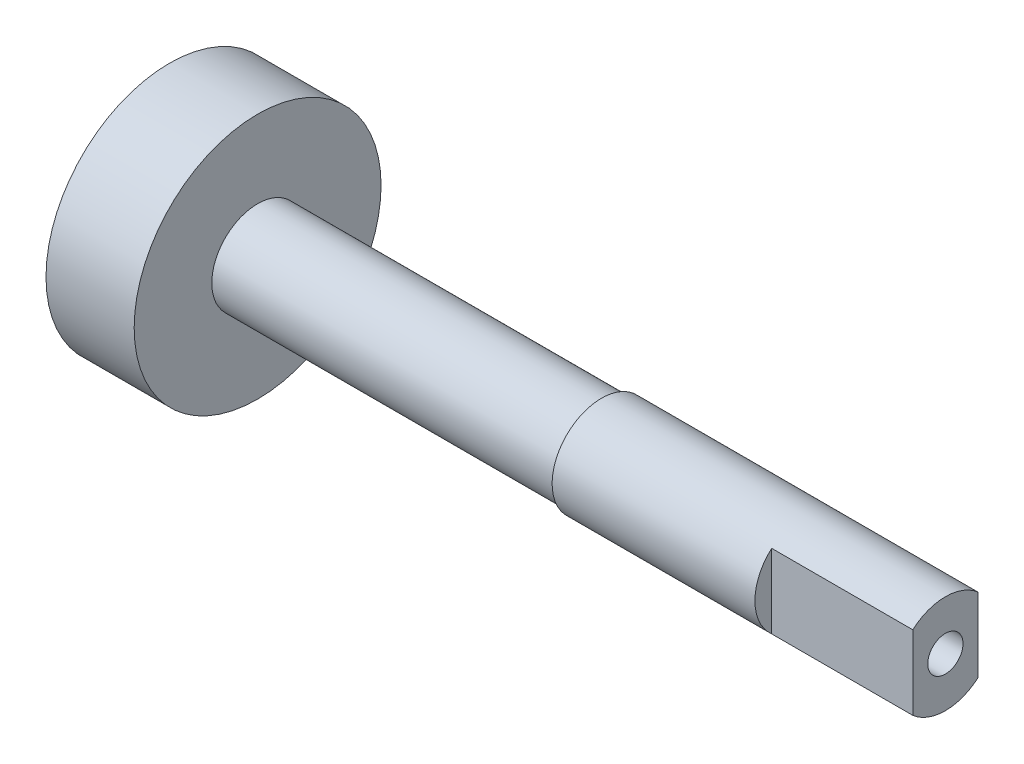
ISO-10303-21;
HEADER;
FILE_DESCRIPTION(('STEP AP214'),'2;1');
FILE_NAME('part.step','',(''),(''),'','','');
FILE_SCHEMA(('AUTOMOTIVE_DESIGN { 1 0 10303 214 1 1 1 1 }'));
ENDSEC;
DATA;
#1=APPLICATION_CONTEXT('core data for automotive mechanical design processes');
#2=APPLICATION_PROTOCOL_DEFINITION('international standard','automotive_design',2000,#1);
#3=PRODUCT_CONTEXT('',#1,'mechanical');
#4=PRODUCT('Part','Part','',(#3));
#5=PRODUCT_RELATED_PRODUCT_CATEGORY('part','',(#4));
#6=PRODUCT_DEFINITION_FORMATION('','',#4);
#7=PRODUCT_DEFINITION_CONTEXT('part definition',#1,'design');
#8=PRODUCT_DEFINITION('design','',#6,#7);
#9=PRODUCT_DEFINITION_SHAPE('','',#8);
#10=(LENGTH_UNIT() NAMED_UNIT(*) SI_UNIT(.MILLI.,.METRE.));
#11=(NAMED_UNIT(*) PLANE_ANGLE_UNIT() SI_UNIT($,.RADIAN.));
#12=(NAMED_UNIT(*) SI_UNIT($,.STERADIAN.) SOLID_ANGLE_UNIT());
#13=UNCERTAINTY_MEASURE_WITH_UNIT(LENGTH_MEASURE(1.E-05),#10,'distance_accuracy_value','');
#14=(GEOMETRIC_REPRESENTATION_CONTEXT(3) GLOBAL_UNCERTAINTY_ASSIGNED_CONTEXT((#13)) GLOBAL_UNIT_ASSIGNED_CONTEXT((#10,
#11,#12)) REPRESENTATION_CONTEXT('',''));
#15=CARTESIAN_POINT('',(0.,0.,0.));
#16=DIRECTION('',(0.,0.,1.));
#17=DIRECTION('',(1.,0.,0.));
#18=AXIS2_PLACEMENT_3D('',#15,#16,#17);
#19=CARTESIAN_POINT('',(-24.5,0.,0.));
#20=DIRECTION('',(1.,0.,0.));
#21=DIRECTION('',(0.,0.,-1.));
#22=AXIS2_PLACEMENT_3D('',#19,#20,#21);
#23=CYLINDRICAL_SURFACE('',#22,7.);
#24=CARTESIAN_POINT('',(-24.5,0.,0.));
#25=DIRECTION('',(-1.,0.,0.));
#26=DIRECTION('',(0.,0.,1.));
#27=AXIS2_PLACEMENT_3D('',#24,#25,#26);
#28=CIRCLE('',#27,7.);
#29=CARTESIAN_POINT('',(-24.5,0.,7.));
#30=VERTEX_POINT('',#29);
#31=EDGE_CURVE('E136',#30,#30,#28,.T.);
#32=ORIENTED_EDGE('',*,*,#31,.F.);
#33=EDGE_LOOP('',(#32));
#34=FACE_BOUND('',#33,.T.);
#35=CARTESIAN_POINT('',(-19.5,0.,0.));
#36=DIRECTION('',(-1.,0.,0.));
#37=DIRECTION('',(0.,0.,1.));
#38=AXIS2_PLACEMENT_3D('',#35,#36,#37);
#39=CIRCLE('',#38,7.);
#40=CARTESIAN_POINT('',(-19.5,0.,7.));
#41=VERTEX_POINT('',#40);
#42=EDGE_CURVE('E140',#41,#41,#39,.T.);
#43=ORIENTED_EDGE('',*,*,#42,.T.);
#44=EDGE_LOOP('',(#43));
#45=FACE_BOUND('',#44,.T.);
#46=ADVANCED_FACE('F47',(#34,#45),#23,.T.);
#47=CARTESIAN_POINT('',(-24.5,0.,0.));
#48=DIRECTION('',(-1.,0.,0.));
#49=DIRECTION('',(0.,0.,1.));
#50=AXIS2_PLACEMENT_3D('',#47,#48,#49);
#51=PLANE('',#50);
#52=ORIENTED_EDGE('',*,*,#31,.T.);
#53=EDGE_LOOP('',(#52));
#54=FACE_BOUND('',#53,.T.);
#55=ADVANCED_FACE('F177',(#54),#51,.T.);
#56=CARTESIAN_POINT('',(-19.5,0.,0.));
#57=DIRECTION('',(-1.,0.,0.));
#58=DIRECTION('',(0.,0.,1.));
#59=AXIS2_PLACEMENT_3D('',#56,#57,#58);
#60=PLANE('',#59);
#61=ORIENTED_EDGE('',*,*,#42,.F.);
#62=EDGE_LOOP('',(#61));
#63=FACE_BOUND('',#62,.T.);
#64=CARTESIAN_POINT('',(-19.5,0.,0.));
#65=DIRECTION('',(1.,0.,0.));
#66=DIRECTION('',(0.,0.,-1.));
#67=AXIS2_PLACEMENT_3D('',#64,#65,#66);
#68=CIRCLE('',#67,2.6);
#69=CARTESIAN_POINT('',(-19.5,0.,-2.6));
#70=VERTEX_POINT('',#69);
#71=EDGE_CURVE('E147',#70,#70,#68,.T.);
#72=ORIENTED_EDGE('',*,*,#71,.F.);
#73=EDGE_LOOP('',(#72));
#74=FACE_BOUND('',#73,.T.);
#75=ADVANCED_FACE('F184',(#63,#74),#60,.F.);
#76=CARTESIAN_POINT('',(0.,0.,0.));
#77=DIRECTION('',(1.,0.,0.));
#78=DIRECTION('',(0.,0.,-1.));
#79=AXIS2_PLACEMENT_3D('',#76,#77,#78);
#80=PLANE('',#79);
#81=CARTESIAN_POINT('',(0.,0.,0.));
#82=DIRECTION('',(1.,0.,0.));
#83=DIRECTION('',(0.,0.,-1.));
#84=AXIS2_PLACEMENT_3D('',#81,#82,#83);
#85=CIRCLE('',#84,2.6);
#86=CARTESIAN_POINT('',(0.,0.,-2.6));
#87=VERTEX_POINT('',#86);
#88=EDGE_CURVE('E150',#87,#87,#85,.T.);
#89=ORIENTED_EDGE('',*,*,#88,.T.);
#90=EDGE_LOOP('',(#89));
#91=FACE_BOUND('',#90,.T.);
#92=CARTESIAN_POINT('',(0.,0.,0.));
#93=DIRECTION('',(1.,0.,0.));
#94=DIRECTION('',(0.,0.,-1.));
#95=AXIS2_PLACEMENT_3D('',#92,#93,#94);
#96=CIRCLE('',#95,2.8);
#97=CARTESIAN_POINT('',(0.,0.,-2.8));
#98=VERTEX_POINT('',#97);
#99=EDGE_CURVE('E51',#98,#98,#96,.T.);
#100=ORIENTED_EDGE('',*,*,#99,.F.);
#101=EDGE_LOOP('',(#100));
#102=FACE_BOUND('',#101,.T.);
#103=ADVANCED_FACE('F210',(#91,#102),#80,.F.);
#104=CARTESIAN_POINT('',(-19.5,0.,0.));
#105=DIRECTION('',(1.,0.,0.));
#106=DIRECTION('',(0.,0.,-1.));
#107=AXIS2_PLACEMENT_3D('',#104,#105,#106);
#108=CYLINDRICAL_SURFACE('',#107,2.6);
#109=ORIENTED_EDGE('',*,*,#71,.T.);
#110=EDGE_LOOP('',(#109));
#111=FACE_BOUND('',#110,.T.);
#112=ORIENTED_EDGE('',*,*,#88,.F.);
#113=EDGE_LOOP('',(#112));
#114=FACE_BOUND('',#113,.T.);
#115=ADVANCED_FACE('F191',(#111,#114),#108,.T.);
#116=CARTESIAN_POINT('',(13.5,0.,0.));
#117=DIRECTION('',(1.,0.,0.));
#118=DIRECTION('',(0.,0.,-1.));
#119=AXIS2_PLACEMENT_3D('',#116,#117,#118);
#120=PLANE('',#119);
#121=CARTESIAN_POINT('',(13.5,0.,0.));
#122=DIRECTION('',(1.,0.,0.));
#123=DIRECTION('',(0.,0.,-1.));
#124=AXIS2_PLACEMENT_3D('',#121,#122,#123);
#125=CIRCLE('',#124,1.);
#126=CARTESIAN_POINT('',(13.5,0.,-1.));
#127=VERTEX_POINT('',#126);
#128=EDGE_CURVE('E123',#127,#127,#125,.T.);
#129=ORIENTED_EDGE('',*,*,#128,.T.);
#130=EDGE_LOOP('',(#129));
#131=FACE_BOUND('',#130,.T.);
#132=ADVANCED_FACE('F172',(#131),#120,.T.);
#133=CARTESIAN_POINT('',(13.5,0.,0.));
#134=DIRECTION('',(1.,0.,0.));
#135=DIRECTION('',(0.,0.,-1.));
#136=AXIS2_PLACEMENT_3D('',#133,#134,#135);
#137=CYLINDRICAL_SURFACE('',#136,1.);
#138=ORIENTED_EDGE('',*,*,#128,.F.);
#139=EDGE_LOOP('',(#138));
#140=FACE_BOUND('',#139,.T.);
#141=CARTESIAN_POINT('',(19.5,0.,0.));
#142=DIRECTION('',(1.,0.,0.));
#143=DIRECTION('',(0.,0.,-1.));
#144=AXIS2_PLACEMENT_3D('',#141,#142,#143);
#145=CIRCLE('',#144,1.);
#146=CARTESIAN_POINT('',(19.5,0.,-1.));
#147=VERTEX_POINT('',#146);
#148=EDGE_CURVE('E132',#147,#147,#145,.T.);
#149=ORIENTED_EDGE('',*,*,#148,.T.);
#150=EDGE_LOOP('',(#149));
#151=FACE_BOUND('',#150,.T.);
#152=ADVANCED_FACE('F164',(#140,#151),#137,.F.);
#153=CARTESIAN_POINT('',(11.5,0.,0.));
#154=DIRECTION('',(1.,0.,0.));
#155=DIRECTION('',(0.,0.,-1.));
#156=AXIS2_PLACEMENT_3D('',#153,#154,#155);
#157=PLANE('',#156);
#158=CARTESIAN_POINT('',(11.5,0.,0.));
#159=DIRECTION('',(1.,0.,0.));
#160=DIRECTION('',(0.,0.,-1.));
#161=AXIS2_PLACEMENT_3D('',#158,#159,#160);
#162=CIRCLE('',#161,2.8);
#163=CARTESIAN_POINT('',(11.5,-2.10178495569837,-1.85));
#164=VERTEX_POINT('',#163);
#165=CARTESIAN_POINT('',(11.5,2.10178495569837,-1.85));
#166=VERTEX_POINT('',#165);
#167=EDGE_CURVE('E113',#164,#166,#162,.T.);
#168=ORIENTED_EDGE('',*,*,#167,.T.);
#169=DIRECTION('',(0.,-1.,0.));
#170=VECTOR('',#169,1.);
#171=CARTESIAN_POINT('',(11.5,2.10178495569837,-1.85));
#172=LINE('',#171,#170);
#173=EDGE_CURVE('E116',#166,#164,#172,.T.);
#174=ORIENTED_EDGE('',*,*,#173,.T.);
#175=EDGE_LOOP('',(#168,#174));
#176=FACE_BOUND('',#175,.T.);
#177=ADVANCED_FACE('F162',(#176),#157,.T.);
#178=CARTESIAN_POINT('',(11.5,2.10178495569837,-1.85));
#179=DIRECTION('',(0.,0.,1.));
#180=DIRECTION('',(1.,0.,0.));
#181=AXIS2_PLACEMENT_3D('',#178,#179,#180);
#182=PLANE('',#181);
#183=DIRECTION('',(0.,-1.,0.));
#184=VECTOR('',#183,1.);
#185=CARTESIAN_POINT('',(19.5,2.10178495569837,-1.85));
#186=LINE('',#185,#184);
#187=CARTESIAN_POINT('',(19.5,2.10178495569837,-1.85));
#188=VERTEX_POINT('',#187);
#189=CARTESIAN_POINT('',(19.5,-2.10178495569837,-1.85));
#190=VERTEX_POINT('',#189);
#191=EDGE_CURVE('E117',#188,#190,#186,.T.);
#192=ORIENTED_EDGE('',*,*,#191,.T.);
#193=DIRECTION('',(1.,0.,0.));
#194=VECTOR('',#193,1.);
#195=CARTESIAN_POINT('',(11.5,-2.10178495569837,-1.85));
#196=LINE('',#195,#194);
#197=EDGE_CURVE('E124',#164,#190,#196,.T.);
#198=ORIENTED_EDGE('',*,*,#197,.F.);
#199=ORIENTED_EDGE('',*,*,#173,.F.);
#200=DIRECTION('',(1.,0.,0.));
#201=VECTOR('',#200,1.);
#202=CARTESIAN_POINT('',(11.5,2.10178495569837,-1.85));
#203=LINE('',#202,#201);
#204=EDGE_CURVE('E72',#166,#188,#203,.T.);
#205=ORIENTED_EDGE('',*,*,#204,.T.);
#206=EDGE_LOOP('',(#192,#198,#199,#205));
#207=FACE_BOUND('',#206,.T.);
#208=ADVANCED_FACE('F159',(#207),#182,.F.);
#209=CARTESIAN_POINT('',(11.5,0.,0.));
#210=DIRECTION('',(1.,0.,0.));
#211=DIRECTION('',(0.,0.,-1.));
#212=AXIS2_PLACEMENT_3D('',#209,#210,#211);
#213=PLANE('',#212);
#214=CARTESIAN_POINT('',(11.5,0.,0.));
#215=DIRECTION('',(1.,0.,0.));
#216=DIRECTION('',(0.,0.,-1.));
#217=AXIS2_PLACEMENT_3D('',#214,#215,#216);
#218=CIRCLE('',#217,2.8);
#219=CARTESIAN_POINT('',(11.5,2.10178495569837,1.85));
#220=VERTEX_POINT('',#219);
#221=CARTESIAN_POINT('',(11.5,-2.10178495569837,1.85));
#222=VERTEX_POINT('',#221);
#223=EDGE_CURVE('E92',#220,#222,#218,.T.);
#224=ORIENTED_EDGE('',*,*,#223,.T.);
#225=DIRECTION('',(0.,1.,0.));
#226=VECTOR('',#225,1.);
#227=CARTESIAN_POINT('',(11.5,2.10178495569837,1.85));
#228=LINE('',#227,#226);
#229=EDGE_CURVE('E94',#222,#220,#228,.T.);
#230=ORIENTED_EDGE('',*,*,#229,.T.);
#231=EDGE_LOOP('',(#224,#230));
#232=FACE_BOUND('',#231,.T.);
#233=ADVANCED_FACE('F93',(#232),#213,.T.);
#234=CARTESIAN_POINT('',(11.5,2.10178495569837,1.85));
#235=DIRECTION('',(0.,0.,-1.));
#236=DIRECTION('',(-1.,0.,0.));
#237=AXIS2_PLACEMENT_3D('',#234,#235,#236);
#238=PLANE('',#237);
#239=DIRECTION('',(0.,1.,0.));
#240=VECTOR('',#239,1.);
#241=CARTESIAN_POINT('',(19.5,2.10178495569837,1.85));
#242=LINE('',#241,#240);
#243=CARTESIAN_POINT('',(19.5,-2.10178495569837,1.85));
#244=VERTEX_POINT('',#243);
#245=CARTESIAN_POINT('',(19.5,2.10178495569837,1.85));
#246=VERTEX_POINT('',#245);
#247=EDGE_CURVE('E98',#244,#246,#242,.T.);
#248=ORIENTED_EDGE('',*,*,#247,.T.);
#249=DIRECTION('',(1.,0.,0.));
#250=VECTOR('',#249,1.);
#251=CARTESIAN_POINT('',(11.5,2.10178495569837,1.85));
#252=LINE('',#251,#250);
#253=EDGE_CURVE('E101',#220,#246,#252,.T.);
#254=ORIENTED_EDGE('',*,*,#253,.F.);
#255=ORIENTED_EDGE('',*,*,#229,.F.);
#256=DIRECTION('',(1.,0.,0.));
#257=VECTOR('',#256,1.);
#258=CARTESIAN_POINT('',(11.5,-2.10178495569837,1.85));
#259=LINE('',#258,#257);
#260=EDGE_CURVE('E64',#222,#244,#259,.T.);
#261=ORIENTED_EDGE('',*,*,#260,.T.);
#262=EDGE_LOOP('',(#248,#254,#255,#261));
#263=FACE_BOUND('',#262,.T.);
#264=ADVANCED_FACE('F100',(#263),#238,.F.);
#265=CARTESIAN_POINT('',(19.5,0.,0.));
#266=DIRECTION('',(1.,0.,0.));
#267=DIRECTION('',(0.,0.,-1.));
#268=AXIS2_PLACEMENT_3D('',#265,#266,#267);
#269=PLANE('',#268);
#270=ORIENTED_EDGE('',*,*,#148,.F.);
#271=EDGE_LOOP('',(#270));
#272=FACE_BOUND('',#271,.T.);
#273=ORIENTED_EDGE('',*,*,#247,.F.);
#274=CARTESIAN_POINT('',(19.5,0.,0.));
#275=DIRECTION('',(1.,0.,0.));
#276=DIRECTION('',(0.,0.,-1.));
#277=AXIS2_PLACEMENT_3D('',#274,#275,#276);
#278=CIRCLE('',#277,2.8);
#279=EDGE_CURVE('E57',#244,#190,#278,.T.);
#280=ORIENTED_EDGE('',*,*,#279,.T.);
#281=ORIENTED_EDGE('',*,*,#191,.F.);
#282=EDGE_CURVE('E11',#188,#246,#278,.T.);
#283=ORIENTED_EDGE('',*,*,#282,.T.);
#284=EDGE_LOOP('',(#273,#280,#281,#283));
#285=FACE_BOUND('',#284,.T.);
#286=ADVANCED_FACE('F158',(#272,#285),#269,.T.);
#287=CARTESIAN_POINT('',(19.5,0.,0.));
#288=DIRECTION('',(-1.,0.,0.));
#289=DIRECTION('',(0.,0.,1.));
#290=AXIS2_PLACEMENT_3D('',#287,#288,#289);
#291=CYLINDRICAL_SURFACE('',#290,2.8);
#292=ORIENTED_EDGE('',*,*,#99,.T.);
#293=EDGE_LOOP('',(#292));
#294=FACE_BOUND('',#293,.T.);
#295=ORIENTED_EDGE('',*,*,#279,.F.);
#296=ORIENTED_EDGE('',*,*,#260,.F.);
#297=ORIENTED_EDGE('',*,*,#223,.F.);
#298=ORIENTED_EDGE('',*,*,#253,.T.);
#299=ORIENTED_EDGE('',*,*,#282,.F.);
#300=ORIENTED_EDGE('',*,*,#204,.F.);
#301=ORIENTED_EDGE('',*,*,#167,.F.);
#302=ORIENTED_EDGE('',*,*,#197,.T.);
#303=EDGE_LOOP('',(#295,#296,#297,#298,#299,#300,#301,#302));
#304=FACE_BOUND('',#303,.T.);
#305=ADVANCED_FACE('F49',(#294,#304),#291,.T.);
#306=CLOSED_SHELL('',(#46,#55,#75,#103,#115,#132,#152,#177,#208,#233,#264,#286,#305));
#307=MANIFOLD_SOLID_BREP('B2',#306);
#308=ADVANCED_BREP_SHAPE_REPRESENTATION('',(#18,#307),#14);
#309=SHAPE_DEFINITION_REPRESENTATION(#9,#308);
ENDSEC;
END-ISO-10303-21;
